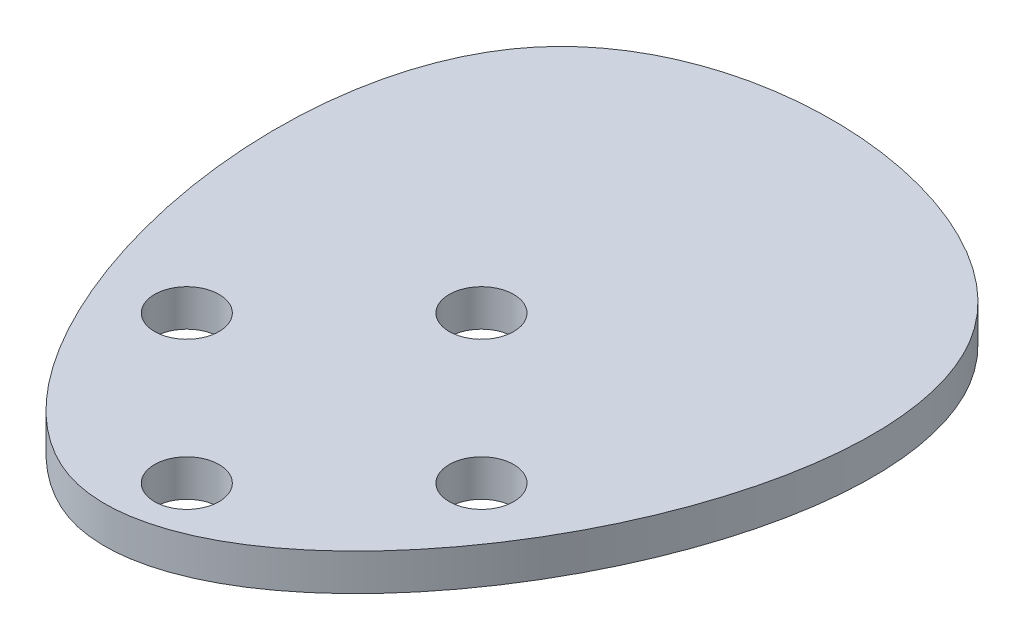
ISO-10303-21;
HEADER;
FILE_DESCRIPTION(('STEP AP214'),'2;1');
FILE_NAME('part.step','',(''),(''),'','','');
FILE_SCHEMA(('AUTOMOTIVE_DESIGN { 1 0 10303 214 1 1 1 1 }'));
ENDSEC;
DATA;
#1=APPLICATION_CONTEXT('core data for automotive mechanical design processes');
#2=APPLICATION_PROTOCOL_DEFINITION('international standard','automotive_design',2000,#1);
#3=PRODUCT_CONTEXT('',#1,'mechanical');
#4=PRODUCT('Part','Part','',(#3));
#5=PRODUCT_RELATED_PRODUCT_CATEGORY('part','',(#4));
#6=PRODUCT_DEFINITION_FORMATION('','',#4);
#7=PRODUCT_DEFINITION_CONTEXT('part definition',#1,'design');
#8=PRODUCT_DEFINITION('design','',#6,#7);
#9=PRODUCT_DEFINITION_SHAPE('','',#8);
#10=(LENGTH_UNIT() NAMED_UNIT(*) SI_UNIT(.MILLI.,.METRE.));
#11=(NAMED_UNIT(*) PLANE_ANGLE_UNIT() SI_UNIT($,.RADIAN.));
#12=(NAMED_UNIT(*) SI_UNIT($,.STERADIAN.) SOLID_ANGLE_UNIT());
#13=UNCERTAINTY_MEASURE_WITH_UNIT(LENGTH_MEASURE(1.E-05),#10,'distance_accuracy_value','');
#14=(GEOMETRIC_REPRESENTATION_CONTEXT(3) GLOBAL_UNCERTAINTY_ASSIGNED_CONTEXT((#13)) GLOBAL_UNIT_ASSIGNED_CONTEXT((#10,
#11,#12)) REPRESENTATION_CONTEXT('',''));
#15=CARTESIAN_POINT('',(0.,0.,0.));
#16=DIRECTION('',(0.,0.,1.));
#17=DIRECTION('',(1.,0.,0.));
#18=AXIS2_PLACEMENT_3D('',#15,#16,#17);
#19=CARTESIAN_POINT('',(0.,2.,11.1));
#20=CARTESIAN_POINT('',(10.4409724585548,2.,9.48044105319148));
#21=CARTESIAN_POINT('',(28.8067505464013,2.,-25.9100185741674));
#22=CARTESIAN_POINT('',(-23.1702263622783,2.,-30.5658086945246));
#23=CARTESIAN_POINT('',(-11.4801117997157,2.,10.9897286945234));
#24=CARTESIAN_POINT('',(-1.0454965550983,2.,11.2621729495397));
#25=CARTESIAN_POINT('',(0.,2.,11.1));
#26=B_SPLINE_CURVE_WITH_KNOTS('',3,(#19,#20,#21,#22,#23,#24,#25),.UNSPECIFIED.,.T.,.F.,(4,1,1,1,
4),(0.,0.36672893319089,0.632779573140432,0.963277957314043,1.),.UNSPECIFIED.);
#27=DIRECTION('',(0.,-1.,0.));
#28=VECTOR('',#27,1.);
#29=SURFACE_OF_LINEAR_EXTRUSION('',#26,#28);
#30=CARTESIAN_POINT('',(0.,2.,11.1));
#31=VERTEX_POINT('',#30);
#32=EDGE_CURVE('E10',#31,#31,#26,.T.);
#33=ORIENTED_EDGE('',*,*,#32,.F.);
#34=EDGE_LOOP('',(#33));
#35=FACE_BOUND('',#34,.T.);
#36=CARTESIAN_POINT('',(0.,0.,11.1));
#37=CARTESIAN_POINT('',(10.4409724585548,0.,9.48044105319148));
#38=CARTESIAN_POINT('',(28.8067505464013,0.,-25.9100185741674));
#39=CARTESIAN_POINT('',(-23.1702263622783,0.,-30.5658086945246));
#40=CARTESIAN_POINT('',(-11.4801117997157,0.,10.9897286945234));
#41=CARTESIAN_POINT('',(-1.0454965550983,0.,11.2621729495397));
#42=CARTESIAN_POINT('',(0.,0.,11.1));
#43=B_SPLINE_CURVE_WITH_KNOTS('',3,(#36,#37,#38,#39,#40,#41,#42),.UNSPECIFIED.,.T.,.F.,(4,1,1,1,
4),(0.,0.36672893319089,0.632779573140432,0.963277957314043,1.),.UNSPECIFIED.);
#44=CARTESIAN_POINT('',(0.,0.,11.1));
#45=VERTEX_POINT('',#44);
#46=EDGE_CURVE('E35',#45,#45,#43,.T.);
#47=ORIENTED_EDGE('',*,*,#46,.T.);
#48=EDGE_LOOP('',(#47));
#49=FACE_BOUND('',#48,.T.);
#50=ADVANCED_FACE('F31',(#35,#49),#29,.F.);
#51=CARTESIAN_POINT('',(1.72717775368275,2.,-26.5677887144238));
#52=DIRECTION('',(0.,-1.,0.));
#53=DIRECTION('',(0.,0.,-1.));
#54=AXIS2_PLACEMENT_3D('',#51,#52,#53);
#55=PLANE('',#54);
#56=CARTESIAN_POINT('',(-8.,2.,0.));
#57=DIRECTION('',(0.,1.,0.));
#58=DIRECTION('',(0.,0.,1.));
#59=AXIS2_PLACEMENT_3D('',#56,#57,#58);
#60=CIRCLE('',#59,1.75);
#61=CARTESIAN_POINT('',(-8.,2.,1.75));
#62=VERTEX_POINT('',#61);
#63=EDGE_CURVE('E69',#62,#62,#60,.T.);
#64=ORIENTED_EDGE('',*,*,#63,.F.);
#65=EDGE_LOOP('',(#64));
#66=FACE_BOUND('',#65,.T.);
#67=CARTESIAN_POINT('',(0.,2.,8.));
#68=DIRECTION('',(0.,1.,0.));
#69=DIRECTION('',(0.,0.,1.));
#70=AXIS2_PLACEMENT_3D('',#67,#68,#69);
#71=CIRCLE('',#70,1.75);
#72=CARTESIAN_POINT('',(0.,2.,9.75));
#73=VERTEX_POINT('',#72);
#74=EDGE_CURVE('E63',#73,#73,#71,.T.);
#75=ORIENTED_EDGE('',*,*,#74,.F.);
#76=EDGE_LOOP('',(#75));
#77=FACE_BOUND('',#76,.T.);
#78=CARTESIAN_POINT('',(8.,2.,0.));
#79=DIRECTION('',(0.,1.,0.));
#80=DIRECTION('',(0.,0.,1.));
#81=AXIS2_PLACEMENT_3D('',#78,#79,#80);
#82=CIRCLE('',#81,1.75);
#83=CARTESIAN_POINT('',(8.,2.,1.75));
#84=VERTEX_POINT('',#83);
#85=EDGE_CURVE('E57',#84,#84,#82,.T.);
#86=ORIENTED_EDGE('',*,*,#85,.F.);
#87=EDGE_LOOP('',(#86));
#88=FACE_BOUND('',#87,.T.);
#89=CARTESIAN_POINT('',(0.,2.,-8.));
#90=DIRECTION('',(0.,1.,0.));
#91=DIRECTION('',(0.,0.,1.));
#92=AXIS2_PLACEMENT_3D('',#89,#90,#91);
#93=CIRCLE('',#92,1.75);
#94=CARTESIAN_POINT('',(0.,2.,-6.25));
#95=VERTEX_POINT('',#94);
#96=EDGE_CURVE('E48',#95,#95,#93,.T.);
#97=ORIENTED_EDGE('',*,*,#96,.F.);
#98=EDGE_LOOP('',(#97));
#99=FACE_BOUND('',#98,.T.);
#100=ORIENTED_EDGE('',*,*,#32,.T.);
#101=EDGE_LOOP('',(#100));
#102=FACE_BOUND('',#101,.T.);
#103=ADVANCED_FACE('F85',(#66,#77,#88,#99,#102),#55,.F.);
#104=CARTESIAN_POINT('',(1.72717775368275,0.,-26.5677887144238));
#105=DIRECTION('',(0.,-1.,0.));
#106=DIRECTION('',(0.,0.,-1.));
#107=AXIS2_PLACEMENT_3D('',#104,#105,#106);
#108=PLANE('',#107);
#109=CARTESIAN_POINT('',(-8.,0.,0.));
#110=DIRECTION('',(0.,1.,0.));
#111=DIRECTION('',(0.,0.,1.));
#112=AXIS2_PLACEMENT_3D('',#109,#110,#111);
#113=CIRCLE('',#112,1.75);
#114=CARTESIAN_POINT('',(-8.,0.,1.75));
#115=VERTEX_POINT('',#114);
#116=EDGE_CURVE('E66',#115,#115,#113,.T.);
#117=ORIENTED_EDGE('',*,*,#116,.T.);
#118=EDGE_LOOP('',(#117));
#119=FACE_BOUND('',#118,.T.);
#120=CARTESIAN_POINT('',(0.,0.,8.));
#121=DIRECTION('',(0.,1.,0.));
#122=DIRECTION('',(0.,0.,1.));
#123=AXIS2_PLACEMENT_3D('',#120,#121,#122);
#124=CIRCLE('',#123,1.75);
#125=CARTESIAN_POINT('',(0.,0.,9.75));
#126=VERTEX_POINT('',#125);
#127=EDGE_CURVE('E60',#126,#126,#124,.T.);
#128=ORIENTED_EDGE('',*,*,#127,.T.);
#129=EDGE_LOOP('',(#128));
#130=FACE_BOUND('',#129,.T.);
#131=CARTESIAN_POINT('',(8.,0.,0.));
#132=DIRECTION('',(0.,1.,0.));
#133=DIRECTION('',(0.,0.,1.));
#134=AXIS2_PLACEMENT_3D('',#131,#132,#133);
#135=CIRCLE('',#134,1.75);
#136=CARTESIAN_POINT('',(8.,0.,1.75));
#137=VERTEX_POINT('',#136);
#138=EDGE_CURVE('E54',#137,#137,#135,.T.);
#139=ORIENTED_EDGE('',*,*,#138,.T.);
#140=EDGE_LOOP('',(#139));
#141=FACE_BOUND('',#140,.T.);
#142=CARTESIAN_POINT('',(0.,0.,-8.));
#143=DIRECTION('',(0.,1.,0.));
#144=DIRECTION('',(0.,0.,1.));
#145=AXIS2_PLACEMENT_3D('',#142,#143,#144);
#146=CIRCLE('',#145,1.75);
#147=CARTESIAN_POINT('',(0.,0.,-6.25));
#148=VERTEX_POINT('',#147);
#149=EDGE_CURVE('E43',#148,#148,#146,.T.);
#150=ORIENTED_EDGE('',*,*,#149,.T.);
#151=EDGE_LOOP('',(#150));
#152=FACE_BOUND('',#151,.T.);
#153=ORIENTED_EDGE('',*,*,#46,.F.);
#154=EDGE_LOOP('',(#153));
#155=FACE_BOUND('',#154,.T.);
#156=ADVANCED_FACE('F75',(#119,#130,#141,#152,#155),#108,.T.);
#157=CARTESIAN_POINT('',(0.,0.,-8.));
#158=DIRECTION('',(0.,1.,0.));
#159=DIRECTION('',(0.,0.,1.));
#160=AXIS2_PLACEMENT_3D('',#157,#158,#159);
#161=CYLINDRICAL_SURFACE('',#160,1.75);
#162=ORIENTED_EDGE('',*,*,#149,.F.);
#163=EDGE_LOOP('',(#162));
#164=FACE_BOUND('',#163,.T.);
#165=ORIENTED_EDGE('',*,*,#96,.T.);
#166=EDGE_LOOP('',(#165));
#167=FACE_BOUND('',#166,.T.);
#168=ADVANCED_FACE('F95',(#164,#167),#161,.F.);
#169=CARTESIAN_POINT('',(8.,0.,0.));
#170=DIRECTION('',(0.,1.,0.));
#171=DIRECTION('',(0.,0.,1.));
#172=AXIS2_PLACEMENT_3D('',#169,#170,#171);
#173=CYLINDRICAL_SURFACE('',#172,1.75);
#174=ORIENTED_EDGE('',*,*,#138,.F.);
#175=EDGE_LOOP('',(#174));
#176=FACE_BOUND('',#175,.T.);
#177=ORIENTED_EDGE('',*,*,#85,.T.);
#178=EDGE_LOOP('',(#177));
#179=FACE_BOUND('',#178,.T.);
#180=ADVANCED_FACE('F97',(#176,#179),#173,.F.);
#181=CARTESIAN_POINT('',(0.,0.,8.));
#182=DIRECTION('',(0.,1.,0.));
#183=DIRECTION('',(0.,0.,1.));
#184=AXIS2_PLACEMENT_3D('',#181,#182,#183);
#185=CYLINDRICAL_SURFACE('',#184,1.75);
#186=ORIENTED_EDGE('',*,*,#127,.F.);
#187=EDGE_LOOP('',(#186));
#188=FACE_BOUND('',#187,.T.);
#189=ORIENTED_EDGE('',*,*,#74,.T.);
#190=EDGE_LOOP('',(#189));
#191=FACE_BOUND('',#190,.T.);
#192=ADVANCED_FACE('F81',(#188,#191),#185,.F.);
#193=CARTESIAN_POINT('',(-8.,0.,0.));
#194=DIRECTION('',(0.,1.,0.));
#195=DIRECTION('',(0.,0.,1.));
#196=AXIS2_PLACEMENT_3D('',#193,#194,#195);
#197=CYLINDRICAL_SURFACE('',#196,1.75);
#198=ORIENTED_EDGE('',*,*,#116,.F.);
#199=EDGE_LOOP('',(#198));
#200=FACE_BOUND('',#199,.T.);
#201=ORIENTED_EDGE('',*,*,#63,.T.);
#202=EDGE_LOOP('',(#201));
#203=FACE_BOUND('',#202,.T.);
#204=ADVANCED_FACE('F78',(#200,#203),#197,.F.);
#205=CLOSED_SHELL('',(#50,#103,#156,#168,#180,#192,#204));
#206=MANIFOLD_SOLID_BREP('B2',#205);
#207=ADVANCED_BREP_SHAPE_REPRESENTATION('',(#18,#206),#14);
#208=SHAPE_DEFINITION_REPRESENTATION(#9,#207);
ENDSEC;
END-ISO-10303-21;
